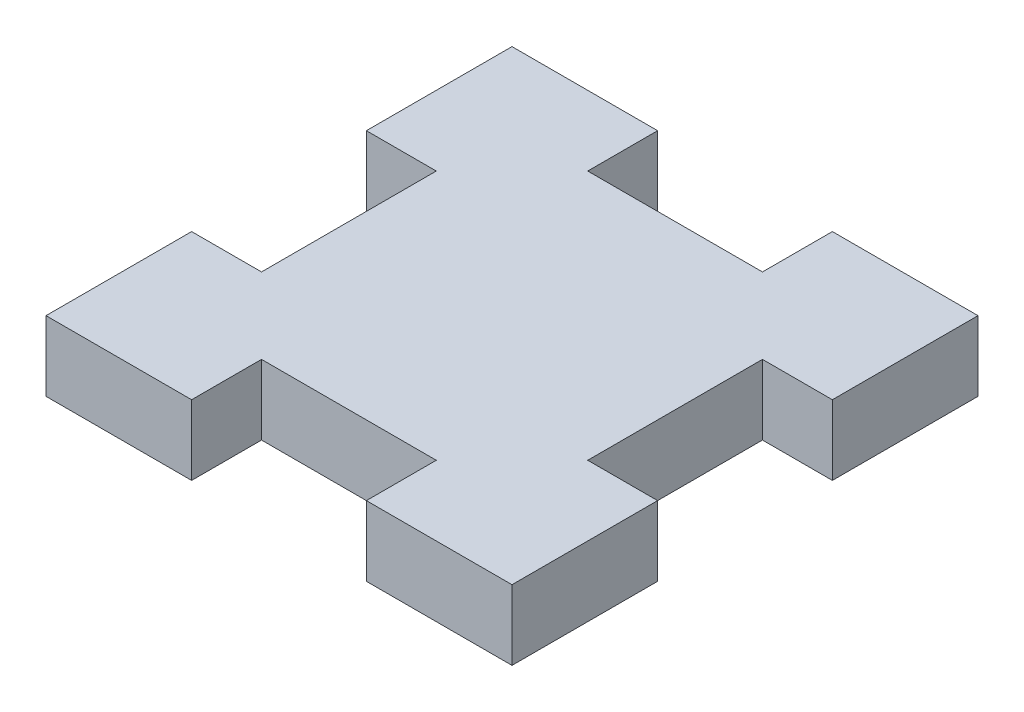
ISO-10303-21;
HEADER;
FILE_DESCRIPTION(('STEP AP214'),'2;1');
FILE_NAME('part.step','',(''),(''),'','','');
FILE_SCHEMA(('AUTOMOTIVE_DESIGN { 1 0 10303 214 1 1 1 1 }'));
ENDSEC;
DATA;
#1=APPLICATION_CONTEXT('core data for automotive mechanical design processes');
#2=APPLICATION_PROTOCOL_DEFINITION('international standard','automotive_design',2000,#1);
#3=PRODUCT_CONTEXT('',#1,'mechanical');
#4=PRODUCT('Part','Part','',(#3));
#5=PRODUCT_RELATED_PRODUCT_CATEGORY('part','',(#4));
#6=PRODUCT_DEFINITION_FORMATION('','',#4);
#7=PRODUCT_DEFINITION_CONTEXT('part definition',#1,'design');
#8=PRODUCT_DEFINITION('design','',#6,#7);
#9=PRODUCT_DEFINITION_SHAPE('','',#8);
#10=(LENGTH_UNIT() NAMED_UNIT(*) SI_UNIT(.MILLI.,.METRE.));
#11=(NAMED_UNIT(*) PLANE_ANGLE_UNIT() SI_UNIT($,.RADIAN.));
#12=(NAMED_UNIT(*) SI_UNIT($,.STERADIAN.) SOLID_ANGLE_UNIT());
#13=UNCERTAINTY_MEASURE_WITH_UNIT(LENGTH_MEASURE(1.E-05),#10,'distance_accuracy_value','');
#14=(GEOMETRIC_REPRESENTATION_CONTEXT(3) GLOBAL_UNCERTAINTY_ASSIGNED_CONTEXT((#13)) GLOBAL_UNIT_ASSIGNED_CONTEXT((#10,
#11,#12)) REPRESENTATION_CONTEXT('',''));
#15=CARTESIAN_POINT('',(0.,0.,0.));
#16=DIRECTION('',(0.,0.,1.));
#17=DIRECTION('',(1.,0.,0.));
#18=AXIS2_PLACEMENT_3D('',#15,#16,#17);
#19=CARTESIAN_POINT('',(40.,6.,0.));
#20=DIRECTION('',(-1.,0.,0.));
#21=DIRECTION('',(0.,0.,1.));
#22=AXIS2_PLACEMENT_3D('',#19,#20,#21);
#23=PLANE('',#22);
#24=DIRECTION('',(0.,0.,-1.));
#25=VECTOR('',#24,1.);
#26=CARTESIAN_POINT('',(40.,0.,0.));
#27=LINE('',#26,#25);
#28=CARTESIAN_POINT('',(40.,0.,0.));
#29=VERTEX_POINT('',#28);
#30=CARTESIAN_POINT('',(40.,0.,-12.5));
#31=VERTEX_POINT('',#30);
#32=EDGE_CURVE('E214',#29,#31,#27,.T.);
#33=ORIENTED_EDGE('',*,*,#32,.T.);
#34=DIRECTION('',(0.,-1.,0.));
#35=VECTOR('',#34,1.);
#36=CARTESIAN_POINT('',(40.,6.,-12.5));
#37=LINE('',#36,#35);
#38=CARTESIAN_POINT('',(40.,6.,-12.5));
#39=VERTEX_POINT('',#38);
#40=EDGE_CURVE('E11',#39,#31,#37,.T.);
#41=ORIENTED_EDGE('',*,*,#40,.F.);
#42=DIRECTION('',(0.,0.,-1.));
#43=VECTOR('',#42,1.);
#44=CARTESIAN_POINT('',(40.,6.,0.));
#45=LINE('',#44,#43);
#46=CARTESIAN_POINT('',(40.,6.,0.));
#47=VERTEX_POINT('',#46);
#48=EDGE_CURVE('E351',#47,#39,#45,.T.);
#49=ORIENTED_EDGE('',*,*,#48,.F.);
#50=DIRECTION('',(0.,-1.,0.));
#51=VECTOR('',#50,1.);
#52=CARTESIAN_POINT('',(40.,6.,0.));
#53=LINE('',#52,#51);
#54=EDGE_CURVE('E209',#47,#29,#53,.T.);
#55=ORIENTED_EDGE('',*,*,#54,.T.);
#56=EDGE_LOOP('',(#33,#41,#49,#55));
#57=FACE_BOUND('',#56,.T.);
#58=ADVANCED_FACE('F41',(#57),#23,.F.);
#59=CARTESIAN_POINT('',(0.,6.,-12.5000000000001));
#60=DIRECTION('',(0.,0.,1.));
#61=DIRECTION('',(1.,0.,0.));
#62=AXIS2_PLACEMENT_3D('',#59,#60,#61);
#63=PLANE('',#62);
#64=DIRECTION('',(-1.,0.,0.));
#65=VECTOR('',#64,1.);
#66=CARTESIAN_POINT('',(0.,0.,-12.5000000000001));
#67=LINE('',#66,#65);
#68=CARTESIAN_POINT('',(34.,0.,-12.5));
#69=VERTEX_POINT('',#68);
#70=EDGE_CURVE('E218',#31,#69,#67,.T.);
#71=ORIENTED_EDGE('',*,*,#70,.T.);
#72=DIRECTION('',(0.,-1.,0.));
#73=VECTOR('',#72,1.);
#74=CARTESIAN_POINT('',(34.,6.,-12.5));
#75=LINE('',#74,#73);
#76=CARTESIAN_POINT('',(34.,6.,-12.5));
#77=VERTEX_POINT('',#76);
#78=EDGE_CURVE('E51',#77,#69,#75,.T.);
#79=ORIENTED_EDGE('',*,*,#78,.F.);
#80=DIRECTION('',(-1.,0.,0.));
#81=VECTOR('',#80,1.);
#82=CARTESIAN_POINT('',(0.,6.,-12.5000000000001));
#83=LINE('',#82,#81);
#84=EDGE_CURVE('E134',#39,#77,#83,.T.);
#85=ORIENTED_EDGE('',*,*,#84,.F.);
#86=ORIENTED_EDGE('',*,*,#40,.T.);
#87=EDGE_LOOP('',(#71,#79,#85,#86));
#88=FACE_BOUND('',#87,.T.);
#89=ADVANCED_FACE('F43',(#88),#63,.F.);
#90=CARTESIAN_POINT('',(34.,6.,0.));
#91=DIRECTION('',(-1.,0.,0.));
#92=DIRECTION('',(0.,0.,1.));
#93=AXIS2_PLACEMENT_3D('',#90,#91,#92);
#94=PLANE('',#93);
#95=DIRECTION('',(0.,0.,-1.));
#96=VECTOR('',#95,1.);
#97=CARTESIAN_POINT('',(34.,0.,0.));
#98=LINE('',#97,#96);
#99=CARTESIAN_POINT('',(34.,0.,-27.5));
#100=VERTEX_POINT('',#99);
#101=EDGE_CURVE('E222',#69,#100,#98,.T.);
#102=ORIENTED_EDGE('',*,*,#101,.T.);
#103=DIRECTION('',(0.,-1.,0.));
#104=VECTOR('',#103,1.);
#105=CARTESIAN_POINT('',(34.,6.,-27.5));
#106=LINE('',#105,#104);
#107=CARTESIAN_POINT('',(34.,6.,-27.5));
#108=VERTEX_POINT('',#107);
#109=EDGE_CURVE('E322',#108,#100,#106,.T.);
#110=ORIENTED_EDGE('',*,*,#109,.F.);
#111=DIRECTION('',(0.,0.,-1.));
#112=VECTOR('',#111,1.);
#113=CARTESIAN_POINT('',(34.,6.,0.));
#114=LINE('',#113,#112);
#115=EDGE_CURVE('E331',#77,#108,#114,.T.);
#116=ORIENTED_EDGE('',*,*,#115,.F.);
#117=ORIENTED_EDGE('',*,*,#78,.T.);
#118=EDGE_LOOP('',(#102,#110,#116,#117));
#119=FACE_BOUND('',#118,.T.);
#120=ADVANCED_FACE('F329',(#119),#94,.F.);
#121=CARTESIAN_POINT('',(0.,6.,-27.5));
#122=DIRECTION('',(0.,0.,1.));
#123=DIRECTION('',(1.,0.,0.));
#124=AXIS2_PLACEMENT_3D('',#121,#122,#123);
#125=PLANE('',#124);
#126=DIRECTION('',(-1.,0.,0.));
#127=VECTOR('',#126,1.);
#128=CARTESIAN_POINT('',(0.,0.,-27.5));
#129=LINE('',#128,#127);
#130=CARTESIAN_POINT('',(40.,0.,-27.5));
#131=VERTEX_POINT('',#130);
#132=EDGE_CURVE('E226',#131,#100,#129,.T.);
#133=ORIENTED_EDGE('',*,*,#132,.F.);
#134=DIRECTION('',(0.,-1.,0.));
#135=VECTOR('',#134,1.);
#136=CARTESIAN_POINT('',(40.,6.,-27.5));
#137=LINE('',#136,#135);
#138=CARTESIAN_POINT('',(40.,6.,-27.5));
#139=VERTEX_POINT('',#138);
#140=EDGE_CURVE('E319',#139,#131,#137,.T.);
#141=ORIENTED_EDGE('',*,*,#140,.F.);
#142=DIRECTION('',(-1.,0.,0.));
#143=VECTOR('',#142,1.);
#144=CARTESIAN_POINT('',(0.,6.,-27.5));
#145=LINE('',#144,#143);
#146=EDGE_CURVE('E343',#139,#108,#145,.T.);
#147=ORIENTED_EDGE('',*,*,#146,.T.);
#148=ORIENTED_EDGE('',*,*,#109,.T.);
#149=EDGE_LOOP('',(#133,#141,#147,#148));
#150=FACE_BOUND('',#149,.T.);
#151=ADVANCED_FACE('F339',(#150),#125,.T.);
#152=CARTESIAN_POINT('',(40.,0.,-40.));
#153=VERTEX_POINT('',#152);
#154=EDGE_CURVE('E219',#131,#153,#27,.T.);
#155=ORIENTED_EDGE('',*,*,#154,.T.);
#156=DIRECTION('',(0.,-1.,0.));
#157=VECTOR('',#156,1.);
#158=CARTESIAN_POINT('',(40.,6.,-40.));
#159=LINE('',#158,#157);
#160=CARTESIAN_POINT('',(40.,6.,-40.));
#161=VERTEX_POINT('',#160);
#162=EDGE_CURVE('E316',#161,#153,#159,.T.);
#163=ORIENTED_EDGE('',*,*,#162,.F.);
#164=EDGE_CURVE('E345',#139,#161,#45,.T.);
#165=ORIENTED_EDGE('',*,*,#164,.F.);
#166=ORIENTED_EDGE('',*,*,#140,.T.);
#167=EDGE_LOOP('',(#155,#163,#165,#166));
#168=FACE_BOUND('',#167,.T.);
#169=ADVANCED_FACE('F440',(#168),#23,.F.);
#170=CARTESIAN_POINT('',(0.,6.,-40.));
#171=DIRECTION('',(0.,0.,-1.));
#172=DIRECTION('',(-1.,0.,0.));
#173=AXIS2_PLACEMENT_3D('',#170,#171,#172);
#174=PLANE('',#173);
#175=DIRECTION('',(1.,0.,0.));
#176=VECTOR('',#175,1.);
#177=CARTESIAN_POINT('',(0.,0.,-40.));
#178=LINE('',#177,#176);
#179=CARTESIAN_POINT('',(27.5,0.,-40.));
#180=VERTEX_POINT('',#179);
#181=EDGE_CURVE('E230',#180,#153,#178,.T.);
#182=ORIENTED_EDGE('',*,*,#181,.F.);
#183=DIRECTION('',(0.,-1.,0.));
#184=VECTOR('',#183,1.);
#185=CARTESIAN_POINT('',(27.5,6.,-40.));
#186=LINE('',#185,#184);
#187=CARTESIAN_POINT('',(27.5,6.,-40.));
#188=VERTEX_POINT('',#187);
#189=EDGE_CURVE('E313',#188,#180,#186,.T.);
#190=ORIENTED_EDGE('',*,*,#189,.F.);
#191=DIRECTION('',(1.,0.,0.));
#192=VECTOR('',#191,1.);
#193=CARTESIAN_POINT('',(0.,6.,-40.));
#194=LINE('',#193,#192);
#195=EDGE_CURVE('E349',#188,#161,#194,.T.);
#196=ORIENTED_EDGE('',*,*,#195,.T.);
#197=ORIENTED_EDGE('',*,*,#162,.T.);
#198=EDGE_LOOP('',(#182,#190,#196,#197));
#199=FACE_BOUND('',#198,.T.);
#200=ADVANCED_FACE('F446',(#199),#174,.T.);
#201=CARTESIAN_POINT('',(27.5,6.,0.));
#202=DIRECTION('',(1.,0.,0.));
#203=DIRECTION('',(0.,0.,-1.));
#204=AXIS2_PLACEMENT_3D('',#201,#202,#203);
#205=PLANE('',#204);
#206=DIRECTION('',(0.,0.,1.));
#207=VECTOR('',#206,1.);
#208=CARTESIAN_POINT('',(27.5,0.,0.));
#209=LINE('',#208,#207);
#210=CARTESIAN_POINT('',(27.5,0.,-34.));
#211=VERTEX_POINT('',#210);
#212=EDGE_CURVE('E234',#180,#211,#209,.T.);
#213=ORIENTED_EDGE('',*,*,#212,.T.);
#214=DIRECTION('',(0.,-1.,0.));
#215=VECTOR('',#214,1.);
#216=CARTESIAN_POINT('',(27.5,6.,-34.));
#217=LINE('',#216,#215);
#218=CARTESIAN_POINT('',(27.5,6.,-34.));
#219=VERTEX_POINT('',#218);
#220=EDGE_CURVE('E310',#219,#211,#217,.T.);
#221=ORIENTED_EDGE('',*,*,#220,.F.);
#222=DIRECTION('',(0.,0.,1.));
#223=VECTOR('',#222,1.);
#224=CARTESIAN_POINT('',(27.5,6.,0.));
#225=LINE('',#224,#223);
#226=EDGE_CURVE('E358',#188,#219,#225,.T.);
#227=ORIENTED_EDGE('',*,*,#226,.F.);
#228=ORIENTED_EDGE('',*,*,#189,.T.);
#229=EDGE_LOOP('',(#213,#221,#227,#228));
#230=FACE_BOUND('',#229,.T.);
#231=ADVANCED_FACE('F452',(#230),#205,.F.);
#232=CARTESIAN_POINT('',(0.,6.,-34.));
#233=DIRECTION('',(0.,0.,-1.));
#234=DIRECTION('',(-1.,0.,0.));
#235=AXIS2_PLACEMENT_3D('',#232,#233,#234);
#236=PLANE('',#235);
#237=DIRECTION('',(1.,0.,0.));
#238=VECTOR('',#237,1.);
#239=CARTESIAN_POINT('',(0.,0.,-34.));
#240=LINE('',#239,#238);
#241=CARTESIAN_POINT('',(12.5,0.,-34.));
#242=VERTEX_POINT('',#241);
#243=EDGE_CURVE('E239',#242,#211,#240,.T.);
#244=ORIENTED_EDGE('',*,*,#243,.F.);
#245=DIRECTION('',(0.,-1.,0.));
#246=VECTOR('',#245,1.);
#247=CARTESIAN_POINT('',(12.5,6.,-34.));
#248=LINE('',#247,#246);
#249=CARTESIAN_POINT('',(12.5,6.,-34.));
#250=VERTEX_POINT('',#249);
#251=EDGE_CURVE('E307',#250,#242,#248,.T.);
#252=ORIENTED_EDGE('',*,*,#251,.F.);
#253=DIRECTION('',(1.,0.,0.));
#254=VECTOR('',#253,1.);
#255=CARTESIAN_POINT('',(0.,6.,-34.));
#256=LINE('',#255,#254);
#257=EDGE_CURVE('E362',#250,#219,#256,.T.);
#258=ORIENTED_EDGE('',*,*,#257,.T.);
#259=ORIENTED_EDGE('',*,*,#220,.T.);
#260=EDGE_LOOP('',(#244,#252,#258,#259));
#261=FACE_BOUND('',#260,.T.);
#262=ADVANCED_FACE('F465',(#261),#236,.T.);
#263=CARTESIAN_POINT('',(12.5,6.,0.));
#264=DIRECTION('',(1.,0.,0.));
#265=DIRECTION('',(0.,0.,-1.));
#266=AXIS2_PLACEMENT_3D('',#263,#264,#265);
#267=PLANE('',#266);
#268=DIRECTION('',(0.,0.,1.));
#269=VECTOR('',#268,1.);
#270=CARTESIAN_POINT('',(12.5,0.,0.));
#271=LINE('',#270,#269);
#272=CARTESIAN_POINT('',(12.5,0.,-40.));
#273=VERTEX_POINT('',#272);
#274=EDGE_CURVE('E243',#273,#242,#271,.T.);
#275=ORIENTED_EDGE('',*,*,#274,.F.);
#276=DIRECTION('',(0.,-1.,0.));
#277=VECTOR('',#276,1.);
#278=CARTESIAN_POINT('',(12.5,6.,-40.));
#279=LINE('',#278,#277);
#280=CARTESIAN_POINT('',(12.5,6.,-40.));
#281=VERTEX_POINT('',#280);
#282=EDGE_CURVE('E304',#281,#273,#279,.T.);
#283=ORIENTED_EDGE('',*,*,#282,.F.);
#284=DIRECTION('',(0.,0.,1.));
#285=VECTOR('',#284,1.);
#286=CARTESIAN_POINT('',(12.5,6.,0.));
#287=LINE('',#286,#285);
#288=EDGE_CURVE('E366',#281,#250,#287,.T.);
#289=ORIENTED_EDGE('',*,*,#288,.T.);
#290=ORIENTED_EDGE('',*,*,#251,.T.);
#291=EDGE_LOOP('',(#275,#283,#289,#290));
#292=FACE_BOUND('',#291,.T.);
#293=ADVANCED_FACE('F467',(#292),#267,.T.);
#294=CARTESIAN_POINT('',(0.,0.,-40.));
#295=VERTEX_POINT('',#294);
#296=EDGE_CURVE('E235',#295,#273,#178,.T.);
#297=ORIENTED_EDGE('',*,*,#296,.F.);
#298=DIRECTION('',(0.,-1.,0.));
#299=VECTOR('',#298,1.);
#300=CARTESIAN_POINT('',(0.,6.,-40.));
#301=LINE('',#300,#299);
#302=CARTESIAN_POINT('',(0.,6.,-40.));
#303=VERTEX_POINT('',#302);
#304=EDGE_CURVE('E301',#303,#295,#301,.T.);
#305=ORIENTED_EDGE('',*,*,#304,.F.);
#306=EDGE_CURVE('E359',#303,#281,#194,.T.);
#307=ORIENTED_EDGE('',*,*,#306,.T.);
#308=ORIENTED_EDGE('',*,*,#282,.T.);
#309=EDGE_LOOP('',(#297,#305,#307,#308));
#310=FACE_BOUND('',#309,.T.);
#311=ADVANCED_FACE('F393',(#310),#174,.T.);
#312=CARTESIAN_POINT('',(0.,6.,0.));
#313=DIRECTION('',(-1.,0.,0.));
#314=DIRECTION('',(0.,0.,1.));
#315=AXIS2_PLACEMENT_3D('',#312,#313,#314);
#316=PLANE('',#315);
#317=DIRECTION('',(0.,0.,-1.));
#318=VECTOR('',#317,1.);
#319=CARTESIAN_POINT('',(0.,0.,0.));
#320=LINE('',#319,#318);
#321=CARTESIAN_POINT('',(0.,0.,-27.5));
#322=VERTEX_POINT('',#321);
#323=EDGE_CURVE('E247',#322,#295,#320,.T.);
#324=ORIENTED_EDGE('',*,*,#323,.F.);
#325=DIRECTION('',(0.,-1.,0.));
#326=VECTOR('',#325,1.);
#327=CARTESIAN_POINT('',(0.,6.,-27.5));
#328=LINE('',#327,#326);
#329=CARTESIAN_POINT('',(0.,6.,-27.5));
#330=VERTEX_POINT('',#329);
#331=EDGE_CURVE('E298',#330,#322,#328,.T.);
#332=ORIENTED_EDGE('',*,*,#331,.F.);
#333=DIRECTION('',(0.,0.,-1.));
#334=VECTOR('',#333,1.);
#335=CARTESIAN_POINT('',(0.,6.,0.));
#336=LINE('',#335,#334);
#337=EDGE_CURVE('E370',#330,#303,#336,.T.);
#338=ORIENTED_EDGE('',*,*,#337,.T.);
#339=ORIENTED_EDGE('',*,*,#304,.T.);
#340=EDGE_LOOP('',(#324,#332,#338,#339));
#341=FACE_BOUND('',#340,.T.);
#342=ADVANCED_FACE('F400',(#341),#316,.T.);
#343=CARTESIAN_POINT('',(0.,6.,-27.5));
#344=DIRECTION('',(0.,0.,-1.));
#345=DIRECTION('',(-1.,0.,0.));
#346=AXIS2_PLACEMENT_3D('',#343,#344,#345);
#347=PLANE('',#346);
#348=DIRECTION('',(1.,0.,0.));
#349=VECTOR('',#348,1.);
#350=CARTESIAN_POINT('',(0.,0.,-27.5));
#351=LINE('',#350,#349);
#352=CARTESIAN_POINT('',(6.,0.,-27.5));
#353=VERTEX_POINT('',#352);
#354=EDGE_CURVE('E251',#322,#353,#351,.T.);
#355=ORIENTED_EDGE('',*,*,#354,.T.);
#356=DIRECTION('',(0.,-1.,0.));
#357=VECTOR('',#356,1.);
#358=CARTESIAN_POINT('',(6.,6.,-27.5));
#359=LINE('',#358,#357);
#360=CARTESIAN_POINT('',(6.,6.,-27.5));
#361=VERTEX_POINT('',#360);
#362=EDGE_CURVE('E294',#361,#353,#359,.T.);
#363=ORIENTED_EDGE('',*,*,#362,.F.);
#364=DIRECTION('',(1.,0.,0.));
#365=VECTOR('',#364,1.);
#366=CARTESIAN_POINT('',(0.,6.,-27.5));
#367=LINE('',#366,#365);
#368=EDGE_CURVE('E374',#330,#361,#367,.T.);
#369=ORIENTED_EDGE('',*,*,#368,.F.);
#370=ORIENTED_EDGE('',*,*,#331,.T.);
#371=EDGE_LOOP('',(#355,#363,#369,#370));
#372=FACE_BOUND('',#371,.T.);
#373=ADVANCED_FACE('F405',(#372),#347,.F.);
#374=CARTESIAN_POINT('',(6.,6.,0.));
#375=DIRECTION('',(1.,0.,0.));
#376=DIRECTION('',(0.,0.,-1.));
#377=AXIS2_PLACEMENT_3D('',#374,#375,#376);
#378=PLANE('',#377);
#379=DIRECTION('',(0.,0.,1.));
#380=VECTOR('',#379,1.);
#381=CARTESIAN_POINT('',(6.,0.,0.));
#382=LINE('',#381,#380);
#383=CARTESIAN_POINT('',(6.,0.,-12.5));
#384=VERTEX_POINT('',#383);
#385=EDGE_CURVE('E255',#353,#384,#382,.T.);
#386=ORIENTED_EDGE('',*,*,#385,.T.);
#387=DIRECTION('',(0.,-1.,0.));
#388=VECTOR('',#387,1.);
#389=CARTESIAN_POINT('',(6.,6.,-12.5));
#390=LINE('',#389,#388);
#391=CARTESIAN_POINT('',(6.,6.,-12.5));
#392=VERTEX_POINT('',#391);
#393=EDGE_CURVE('E291',#392,#384,#390,.T.);
#394=ORIENTED_EDGE('',*,*,#393,.F.);
#395=DIRECTION('',(0.,0.,1.));
#396=VECTOR('',#395,1.);
#397=CARTESIAN_POINT('',(6.,6.,0.));
#398=LINE('',#397,#396);
#399=EDGE_CURVE('E378',#361,#392,#398,.T.);
#400=ORIENTED_EDGE('',*,*,#399,.F.);
#401=ORIENTED_EDGE('',*,*,#362,.T.);
#402=EDGE_LOOP('',(#386,#394,#400,#401));
#403=FACE_BOUND('',#402,.T.);
#404=ADVANCED_FACE('F411',(#403),#378,.F.);
#405=CARTESIAN_POINT('',(0.,6.,-12.5));
#406=DIRECTION('',(0.,0.,-1.));
#407=DIRECTION('',(-1.,0.,0.));
#408=AXIS2_PLACEMENT_3D('',#405,#406,#407);
#409=PLANE('',#408);
#410=DIRECTION('',(1.,0.,0.));
#411=VECTOR('',#410,1.);
#412=CARTESIAN_POINT('',(0.,0.,-12.5));
#413=LINE('',#412,#411);
#414=CARTESIAN_POINT('',(0.,0.,-12.5));
#415=VERTEX_POINT('',#414);
#416=EDGE_CURVE('E259',#415,#384,#413,.T.);
#417=ORIENTED_EDGE('',*,*,#416,.F.);
#418=DIRECTION('',(0.,-1.,0.));
#419=VECTOR('',#418,1.);
#420=CARTESIAN_POINT('',(0.,6.,-12.5));
#421=LINE('',#420,#419);
#422=CARTESIAN_POINT('',(0.,6.,-12.5));
#423=VERTEX_POINT('',#422);
#424=EDGE_CURVE('E288',#423,#415,#421,.T.);
#425=ORIENTED_EDGE('',*,*,#424,.F.);
#426=DIRECTION('',(1.,0.,0.));
#427=VECTOR('',#426,1.);
#428=CARTESIAN_POINT('',(0.,6.,-12.5));
#429=LINE('',#428,#427);
#430=EDGE_CURVE('E381',#423,#392,#429,.T.);
#431=ORIENTED_EDGE('',*,*,#430,.T.);
#432=ORIENTED_EDGE('',*,*,#393,.T.);
#433=EDGE_LOOP('',(#417,#425,#431,#432));
#434=FACE_BOUND('',#433,.T.);
#435=ADVANCED_FACE('F415',(#434),#409,.T.);
#436=CARTESIAN_POINT('',(0.,0.,0.));
#437=VERTEX_POINT('',#436);
#438=EDGE_CURVE('E252',#437,#415,#320,.T.);
#439=ORIENTED_EDGE('',*,*,#438,.F.);
#440=DIRECTION('',(0.,-1.,0.));
#441=VECTOR('',#440,1.);
#442=CARTESIAN_POINT('',(0.,6.,0.));
#443=LINE('',#442,#441);
#444=CARTESIAN_POINT('',(0.,6.,0.));
#445=VERTEX_POINT('',#444);
#446=EDGE_CURVE('E285',#445,#437,#443,.T.);
#447=ORIENTED_EDGE('',*,*,#446,.F.);
#448=EDGE_CURVE('E375',#445,#423,#336,.T.);
#449=ORIENTED_EDGE('',*,*,#448,.T.);
#450=ORIENTED_EDGE('',*,*,#424,.T.);
#451=EDGE_LOOP('',(#439,#447,#449,#450));
#452=FACE_BOUND('',#451,.T.);
#453=ADVANCED_FACE('F419',(#452),#316,.T.);
#454=CARTESIAN_POINT('',(0.,6.,0.));
#455=DIRECTION('',(0.,0.,-1.));
#456=DIRECTION('',(-1.,0.,0.));
#457=AXIS2_PLACEMENT_3D('',#454,#455,#456);
#458=PLANE('',#457);
#459=DIRECTION('',(1.,0.,0.));
#460=VECTOR('',#459,1.);
#461=CARTESIAN_POINT('',(0.,0.,0.));
#462=LINE('',#461,#460);
#463=CARTESIAN_POINT('',(12.5,0.,0.));
#464=VERTEX_POINT('',#463);
#465=EDGE_CURVE('E263',#437,#464,#462,.T.);
#466=ORIENTED_EDGE('',*,*,#465,.T.);
#467=DIRECTION('',(0.,-1.,0.));
#468=VECTOR('',#467,1.);
#469=CARTESIAN_POINT('',(12.5,6.,0.));
#470=LINE('',#469,#468);
#471=CARTESIAN_POINT('',(12.5,6.,0.));
#472=VERTEX_POINT('',#471);
#473=EDGE_CURVE('E281',#472,#464,#470,.T.);
#474=ORIENTED_EDGE('',*,*,#473,.F.);
#475=DIRECTION('',(1.,0.,0.));
#476=VECTOR('',#475,1.);
#477=CARTESIAN_POINT('',(0.,6.,0.));
#478=LINE('',#477,#476);
#479=EDGE_CURVE('E211',#445,#472,#478,.T.);
#480=ORIENTED_EDGE('',*,*,#479,.F.);
#481=ORIENTED_EDGE('',*,*,#446,.T.);
#482=EDGE_LOOP('',(#466,#474,#480,#481));
#483=FACE_BOUND('',#482,.T.);
#484=ADVANCED_FACE('F423',(#483),#458,.F.);
#485=CARTESIAN_POINT('',(12.5,6.,0.));
#486=DIRECTION('',(-1.,0.,0.));
#487=DIRECTION('',(0.,0.,1.));
#488=AXIS2_PLACEMENT_3D('',#485,#486,#487);
#489=PLANE('',#488);
#490=DIRECTION('',(0.,0.,-1.));
#491=VECTOR('',#490,1.);
#492=CARTESIAN_POINT('',(12.5,0.,0.));
#493=LINE('',#492,#491);
#494=CARTESIAN_POINT('',(12.5,0.,-6.));
#495=VERTEX_POINT('',#494);
#496=EDGE_CURVE('E266',#464,#495,#493,.T.);
#497=ORIENTED_EDGE('',*,*,#496,.T.);
#498=DIRECTION('',(0.,-1.,0.));
#499=VECTOR('',#498,1.);
#500=CARTESIAN_POINT('',(12.5,6.,-6.));
#501=LINE('',#500,#499);
#502=CARTESIAN_POINT('',(12.5,6.,-6.));
#503=VERTEX_POINT('',#502);
#504=EDGE_CURVE('E196',#503,#495,#501,.T.);
#505=ORIENTED_EDGE('',*,*,#504,.F.);
#506=DIRECTION('',(0.,0.,-1.));
#507=VECTOR('',#506,1.);
#508=CARTESIAN_POINT('',(12.5,6.,0.));
#509=LINE('',#508,#507);
#510=EDGE_CURVE('E201',#472,#503,#509,.T.);
#511=ORIENTED_EDGE('',*,*,#510,.F.);
#512=ORIENTED_EDGE('',*,*,#473,.T.);
#513=EDGE_LOOP('',(#497,#505,#511,#512));
#514=FACE_BOUND('',#513,.T.);
#515=ADVANCED_FACE('F427',(#514),#489,.F.);
#516=CARTESIAN_POINT('',(0.,6.,-6.));
#517=DIRECTION('',(0.,0.,1.));
#518=DIRECTION('',(1.,0.,0.));
#519=AXIS2_PLACEMENT_3D('',#516,#517,#518);
#520=PLANE('',#519);
#521=DIRECTION('',(-1.,0.,0.));
#522=VECTOR('',#521,1.);
#523=CARTESIAN_POINT('',(0.,0.,-6.));
#524=LINE('',#523,#522);
#525=CARTESIAN_POINT('',(27.5,0.,-6.00000000000001));
#526=VERTEX_POINT('',#525);
#527=EDGE_CURVE('E190',#526,#495,#524,.T.);
#528=ORIENTED_EDGE('',*,*,#527,.F.);
#529=DIRECTION('',(0.,-1.,0.));
#530=VECTOR('',#529,1.);
#531=CARTESIAN_POINT('',(27.5,6.,-6.00000000000001));
#532=LINE('',#531,#530);
#533=CARTESIAN_POINT('',(27.5,6.,-6.00000000000001));
#534=VERTEX_POINT('',#533);
#535=EDGE_CURVE('E185',#534,#526,#532,.T.);
#536=ORIENTED_EDGE('',*,*,#535,.F.);
#537=DIRECTION('',(-1.,0.,0.));
#538=VECTOR('',#537,1.);
#539=CARTESIAN_POINT('',(0.,6.,-6.));
#540=LINE('',#539,#538);
#541=EDGE_CURVE('E188',#534,#503,#540,.T.);
#542=ORIENTED_EDGE('',*,*,#541,.T.);
#543=ORIENTED_EDGE('',*,*,#504,.T.);
#544=EDGE_LOOP('',(#528,#536,#542,#543));
#545=FACE_BOUND('',#544,.T.);
#546=ADVANCED_FACE('F187',(#545),#520,.T.);
#547=CARTESIAN_POINT('',(27.5,6.,0.));
#548=DIRECTION('',(-1.,0.,0.));
#549=DIRECTION('',(0.,0.,1.));
#550=AXIS2_PLACEMENT_3D('',#547,#548,#549);
#551=PLANE('',#550);
#552=DIRECTION('',(0.,0.,-1.));
#553=VECTOR('',#552,1.);
#554=CARTESIAN_POINT('',(27.5,0.,0.));
#555=LINE('',#554,#553);
#556=CARTESIAN_POINT('',(27.5,0.,0.));
#557=VERTEX_POINT('',#556);
#558=EDGE_CURVE('E272',#557,#526,#555,.T.);
#559=ORIENTED_EDGE('',*,*,#558,.F.);
#560=DIRECTION('',(0.,-1.,0.));
#561=VECTOR('',#560,1.);
#562=CARTESIAN_POINT('',(27.5,6.,0.));
#563=LINE('',#562,#561);
#564=CARTESIAN_POINT('',(27.5,6.,0.));
#565=VERTEX_POINT('',#564);
#566=EDGE_CURVE('E123',#565,#557,#563,.T.);
#567=ORIENTED_EDGE('',*,*,#566,.F.);
#568=DIRECTION('',(0.,0.,-1.));
#569=VECTOR('',#568,1.);
#570=CARTESIAN_POINT('',(27.5,6.,0.));
#571=LINE('',#570,#569);
#572=EDGE_CURVE('E199',#565,#534,#571,.T.);
#573=ORIENTED_EDGE('',*,*,#572,.T.);
#574=ORIENTED_EDGE('',*,*,#535,.T.);
#575=EDGE_LOOP('',(#559,#567,#573,#574));
#576=FACE_BOUND('',#575,.T.);
#577=ADVANCED_FACE('F205',(#576),#551,.T.);
#578=EDGE_CURVE('E126',#557,#29,#462,.T.);
#579=ORIENTED_EDGE('',*,*,#578,.T.);
#580=ORIENTED_EDGE('',*,*,#54,.F.);
#581=EDGE_CURVE('E59',#565,#47,#478,.T.);
#582=ORIENTED_EDGE('',*,*,#581,.F.);
#583=ORIENTED_EDGE('',*,*,#566,.T.);
#584=EDGE_LOOP('',(#579,#580,#582,#583));
#585=FACE_BOUND('',#584,.T.);
#586=ADVANCED_FACE('F546',(#585),#458,.F.);
#587=CARTESIAN_POINT('',(0.,6.,0.));
#588=DIRECTION('',(0.,1.,0.));
#589=DIRECTION('',(0.,0.,1.));
#590=AXIS2_PLACEMENT_3D('',#587,#588,#589);
#591=PLANE('',#590);
#592=ORIENTED_EDGE('',*,*,#48,.T.);
#593=ORIENTED_EDGE('',*,*,#84,.T.);
#594=ORIENTED_EDGE('',*,*,#115,.T.);
#595=ORIENTED_EDGE('',*,*,#146,.F.);
#596=ORIENTED_EDGE('',*,*,#164,.T.);
#597=ORIENTED_EDGE('',*,*,#195,.F.);
#598=ORIENTED_EDGE('',*,*,#226,.T.);
#599=ORIENTED_EDGE('',*,*,#257,.F.);
#600=ORIENTED_EDGE('',*,*,#288,.F.);
#601=ORIENTED_EDGE('',*,*,#306,.F.);
#602=ORIENTED_EDGE('',*,*,#337,.F.);
#603=ORIENTED_EDGE('',*,*,#368,.T.);
#604=ORIENTED_EDGE('',*,*,#399,.T.);
#605=ORIENTED_EDGE('',*,*,#430,.F.);
#606=ORIENTED_EDGE('',*,*,#448,.F.);
#607=ORIENTED_EDGE('',*,*,#479,.T.);
#608=ORIENTED_EDGE('',*,*,#510,.T.);
#609=ORIENTED_EDGE('',*,*,#541,.F.);
#610=ORIENTED_EDGE('',*,*,#572,.F.);
#611=ORIENTED_EDGE('',*,*,#581,.T.);
#612=EDGE_LOOP('',(#592,#593,#594,#595,#596,#597,#598,#599,#600,#601,#602,#603,#604,#605,#606,
#607,#608,#609,#610,#611));
#613=FACE_BOUND('',#612,.T.);
#614=ADVANCED_FACE('F198',(#613),#591,.T.);
#615=CARTESIAN_POINT('',(0.,0.,0.));
#616=DIRECTION('',(0.,1.,0.));
#617=DIRECTION('',(0.,0.,1.));
#618=AXIS2_PLACEMENT_3D('',#615,#616,#617);
#619=PLANE('',#618);
#620=ORIENTED_EDGE('',*,*,#32,.F.);
#621=ORIENTED_EDGE('',*,*,#578,.F.);
#622=ORIENTED_EDGE('',*,*,#558,.T.);
#623=ORIENTED_EDGE('',*,*,#527,.T.);
#624=ORIENTED_EDGE('',*,*,#496,.F.);
#625=ORIENTED_EDGE('',*,*,#465,.F.);
#626=ORIENTED_EDGE('',*,*,#438,.T.);
#627=ORIENTED_EDGE('',*,*,#416,.T.);
#628=ORIENTED_EDGE('',*,*,#385,.F.);
#629=ORIENTED_EDGE('',*,*,#354,.F.);
#630=ORIENTED_EDGE('',*,*,#323,.T.);
#631=ORIENTED_EDGE('',*,*,#296,.T.);
#632=ORIENTED_EDGE('',*,*,#274,.T.);
#633=ORIENTED_EDGE('',*,*,#243,.T.);
#634=ORIENTED_EDGE('',*,*,#212,.F.);
#635=ORIENTED_EDGE('',*,*,#181,.T.);
#636=ORIENTED_EDGE('',*,*,#154,.F.);
#637=ORIENTED_EDGE('',*,*,#132,.T.);
#638=ORIENTED_EDGE('',*,*,#101,.F.);
#639=ORIENTED_EDGE('',*,*,#70,.F.);
#640=EDGE_LOOP('',(#620,#621,#622,#623,#624,#625,#626,#627,#628,#629,#630,#631,#632,#633,#634,
#635,#636,#637,#638,#639));
#641=FACE_BOUND('',#640,.T.);
#642=ADVANCED_FACE('F334',(#641),#619,.F.);
#643=CLOSED_SHELL('',(#58,#89,#120,#151,#169,#200,#231,#262,#293,#311,#342,#373,#404,#435,#453,
#484,#515,#546,#577,#586,#614,#642));
#644=MANIFOLD_SOLID_BREP('B2',#643);
#645=ADVANCED_BREP_SHAPE_REPRESENTATION('',(#18,#644),#14);
#646=SHAPE_DEFINITION_REPRESENTATION(#9,#645);
ENDSEC;
END-ISO-10303-21;
